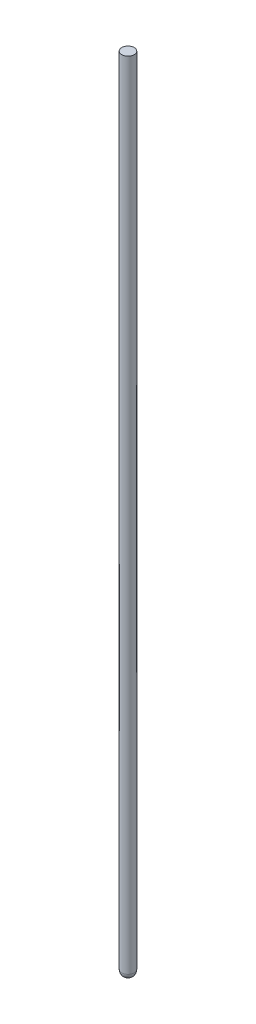
ISO-10303-21;
HEADER;
FILE_DESCRIPTION(('STEP AP214'),'2;1');
FILE_NAME('part.step','',(''),(''),'','','');
FILE_SCHEMA(('AUTOMOTIVE_DESIGN { 1 0 10303 214 1 1 1 1 }'));
ENDSEC;
DATA;
#1=APPLICATION_CONTEXT('core data for automotive mechanical design processes');
#2=APPLICATION_PROTOCOL_DEFINITION('international standard','automotive_design',2000,#1);
#3=PRODUCT_CONTEXT('',#1,'mechanical');
#4=PRODUCT('Part','Part','',(#3));
#5=PRODUCT_RELATED_PRODUCT_CATEGORY('part','',(#4));
#6=PRODUCT_DEFINITION_FORMATION('','',#4);
#7=PRODUCT_DEFINITION_CONTEXT('part definition',#1,'design');
#8=PRODUCT_DEFINITION('design','',#6,#7);
#9=PRODUCT_DEFINITION_SHAPE('','',#8);
#10=(LENGTH_UNIT() NAMED_UNIT(*) SI_UNIT(.MILLI.,.METRE.));
#11=(NAMED_UNIT(*) PLANE_ANGLE_UNIT() SI_UNIT($,.RADIAN.));
#12=(NAMED_UNIT(*) SI_UNIT($,.STERADIAN.) SOLID_ANGLE_UNIT());
#13=UNCERTAINTY_MEASURE_WITH_UNIT(LENGTH_MEASURE(1.E-05),#10,'distance_accuracy_value','');
#14=(GEOMETRIC_REPRESENTATION_CONTEXT(3) GLOBAL_UNCERTAINTY_ASSIGNED_CONTEXT((#13)) GLOBAL_UNIT_ASSIGNED_CONTEXT((#10,
#11,#12)) REPRESENTATION_CONTEXT('',''));
#15=CARTESIAN_POINT('',(0.,0.,0.));
#16=DIRECTION('',(0.,0.,1.));
#17=DIRECTION('',(1.,0.,0.));
#18=AXIS2_PLACEMENT_3D('',#15,#16,#17);
#19=CARTESIAN_POINT('',(0.,25.4,0.));
#20=DIRECTION('',(0.,-1.,0.));
#21=DIRECTION('',(0.,0.,-1.));
#22=AXIS2_PLACEMENT_3D('',#19,#20,#21);
#23=CYLINDRICAL_SURFACE('',#22,0.198437500000002);
#24=CARTESIAN_POINT('',(0.,25.4,0.));
#25=DIRECTION('',(0.,1.,0.));
#26=DIRECTION('',(0.,0.,1.));
#27=AXIS2_PLACEMENT_3D('',#24,#25,#26);
#28=CIRCLE('',#27,0.198437500000002);
#29=CARTESIAN_POINT('',(0.,25.4,0.198437500000002));
#30=VERTEX_POINT('',#29);
#31=EDGE_CURVE('E10',#30,#30,#28,.T.);
#32=ORIENTED_EDGE('',*,*,#31,.F.);
#33=EDGE_LOOP('',(#32));
#34=FACE_BOUND('',#33,.T.);
#35=CARTESIAN_POINT('',(0.,0.,0.));
#36=DIRECTION('',(0.,1.,0.));
#37=DIRECTION('',(0.,0.,1.));
#38=AXIS2_PLACEMENT_3D('',#35,#36,#37);
#39=CIRCLE('',#38,0.198437500000002);
#40=CARTESIAN_POINT('',(0.,0.,0.198437500000002));
#41=VERTEX_POINT('',#40);
#42=EDGE_CURVE('E35',#41,#41,#39,.T.);
#43=ORIENTED_EDGE('',*,*,#42,.T.);
#44=EDGE_LOOP('',(#43));
#45=FACE_BOUND('',#44,.T.);
#46=ADVANCED_FACE('F31',(#34,#45),#23,.T.);
#47=CARTESIAN_POINT('',(0.,25.4,0.));
#48=DIRECTION('',(0.,1.,0.));
#49=DIRECTION('',(0.,0.,1.));
#50=AXIS2_PLACEMENT_3D('',#47,#48,#49);
#51=PLANE('',#50);
#52=ORIENTED_EDGE('',*,*,#31,.T.);
#53=EDGE_LOOP('',(#52));
#54=FACE_BOUND('',#53,.T.);
#55=ADVANCED_FACE('F46',(#54),#51,.T.);
#56=CARTESIAN_POINT('',(0.,0.,0.));
#57=DIRECTION('',(0.,0.,1.));
#58=DIRECTION('',(1.,0.,0.));
#59=AXIS2_PLACEMENT_3D('',#56,#57,#58);
#60=SPHERICAL_SURFACE('',#59,0.198437500000002);
#61=CARTESIAN_POINT('',(0.,0.,0.));
#62=DIRECTION('',(0.,1.,0.));
#63=DIRECTION('',(0.,0.,1.));
#64=AXIS2_PLACEMENT_3D('',#61,#62,#63);
#65=SPHERICAL_SURFACE('',#64,0.198437500000002);
#66=ORIENTED_EDGE('',*,*,#42,.F.);
#67=EDGE_LOOP('',(#66));
#68=FACE_BOUND('',#67,.T.);
#69=ADVANCED_FACE('F33',(#68),#65,.T.);
#70=CLOSED_SHELL('',(#46,#55,#69));
#71=MANIFOLD_SOLID_BREP('B2',#70);
#72=ADVANCED_BREP_SHAPE_REPRESENTATION('',(#18,#71),#14);
#73=SHAPE_DEFINITION_REPRESENTATION(#9,#72);
ENDSEC;
END-ISO-10303-21;
